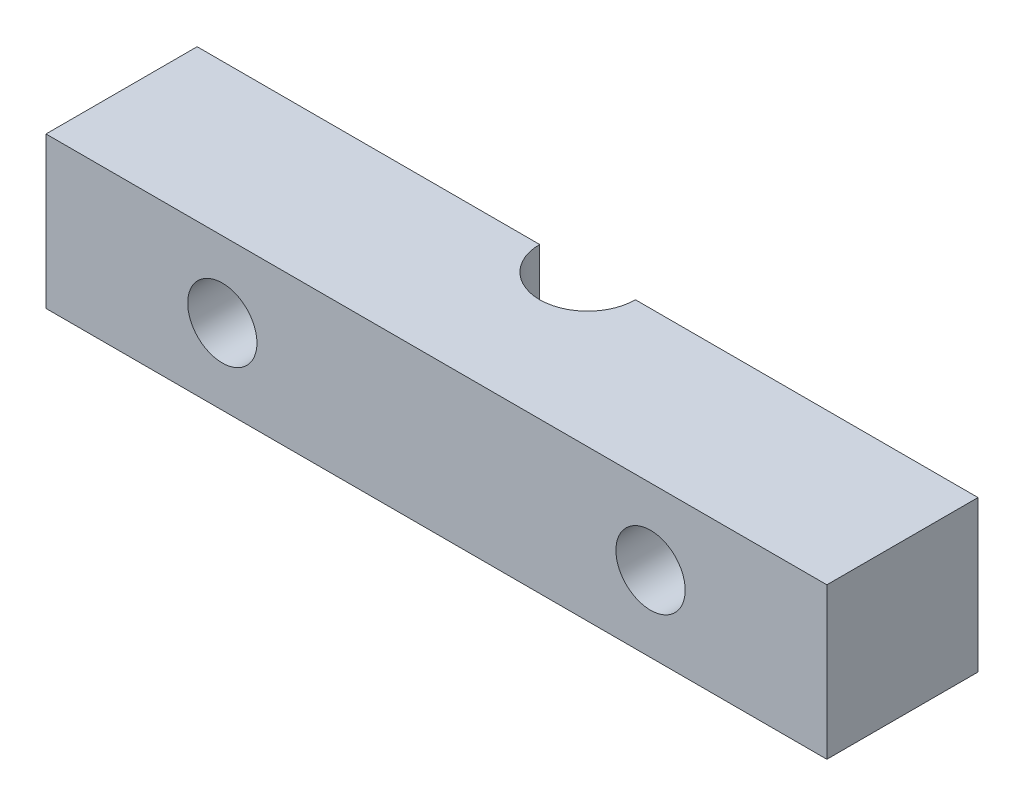
ISO-10303-21;
HEADER;
FILE_DESCRIPTION(('STEP AP214'),'2;1');
FILE_NAME('part.step','',(''),(''),'','','');
FILE_SCHEMA(('AUTOMOTIVE_DESIGN { 1 0 10303 214 1 1 1 1 }'));
ENDSEC;
DATA;
#1=APPLICATION_CONTEXT('core data for automotive mechanical design processes');
#2=APPLICATION_PROTOCOL_DEFINITION('international standard','automotive_design',2000,#1);
#3=PRODUCT_CONTEXT('',#1,'mechanical');
#4=PRODUCT('Part','Part','',(#3));
#5=PRODUCT_RELATED_PRODUCT_CATEGORY('part','',(#4));
#6=PRODUCT_DEFINITION_FORMATION('','',#4);
#7=PRODUCT_DEFINITION_CONTEXT('part definition',#1,'design');
#8=PRODUCT_DEFINITION('design','',#6,#7);
#9=PRODUCT_DEFINITION_SHAPE('','',#8);
#10=(LENGTH_UNIT() NAMED_UNIT(*) SI_UNIT(.MILLI.,.METRE.));
#11=(NAMED_UNIT(*) PLANE_ANGLE_UNIT() SI_UNIT($,.RADIAN.));
#12=(NAMED_UNIT(*) SI_UNIT($,.STERADIAN.) SOLID_ANGLE_UNIT());
#13=UNCERTAINTY_MEASURE_WITH_UNIT(LENGTH_MEASURE(1.E-05),#10,'distance_accuracy_value','');
#14=(GEOMETRIC_REPRESENTATION_CONTEXT(3) GLOBAL_UNCERTAINTY_ASSIGNED_CONTEXT((#13)) GLOBAL_UNIT_ASSIGNED_CONTEXT((#10,
#11,#12)) REPRESENTATION_CONTEXT('',''));
#15=CARTESIAN_POINT('',(0.,0.,0.));
#16=DIRECTION('',(0.,0.,1.));
#17=DIRECTION('',(1.,0.,0.));
#18=AXIS2_PLACEMENT_3D('',#15,#16,#17);
#19=CARTESIAN_POINT('',(0.,0.,0.));
#20=DIRECTION('',(0.,0.,1.));
#21=DIRECTION('',(1.,0.,0.));
#22=AXIS2_PLACEMENT_3D('',#19,#20,#21);
#23=PLANE('',#22);
#24=CARTESIAN_POINT('',(8.5,0.,0.));
#25=DIRECTION('',(0.,0.,1.));
#26=DIRECTION('',(1.,0.,0.));
#27=AXIS2_PLACEMENT_3D('',#24,#25,#26);
#28=CIRCLE('',#27,1.375);
#29=CARTESIAN_POINT('',(9.875,0.,0.));
#30=VERTEX_POINT('',#29);
#31=EDGE_CURVE('E119',#30,#30,#28,.T.);
#32=ORIENTED_EDGE('',*,*,#31,.T.);
#33=EDGE_LOOP('',(#32));
#34=FACE_BOUND('',#33,.T.);
#35=DIRECTION('',(1.,0.,0.));
#36=VECTOR('',#35,1.);
#37=CARTESIAN_POINT('',(-15.5,-3.,0.));
#38=LINE('',#37,#36);
#39=CARTESIAN_POINT('',(1.9,-3.,0.));
#40=VERTEX_POINT('',#39);
#41=CARTESIAN_POINT('',(15.5,-3.,0.));
#42=VERTEX_POINT('',#41);
#43=EDGE_CURVE('E87',#40,#42,#38,.T.);
#44=ORIENTED_EDGE('',*,*,#43,.F.);
#45=DIRECTION('',(0.,1.,0.));
#46=VECTOR('',#45,1.);
#47=CARTESIAN_POINT('',(1.9,-3.,0.));
#48=LINE('',#47,#46);
#49=CARTESIAN_POINT('',(1.9,3.,0.));
#50=VERTEX_POINT('',#49);
#51=EDGE_CURVE('E58',#40,#50,#48,.T.);
#52=ORIENTED_EDGE('',*,*,#51,.T.);
#53=DIRECTION('',(-1.,0.,0.));
#54=VECTOR('',#53,1.);
#55=CARTESIAN_POINT('',(-15.5,3.,0.));
#56=LINE('',#55,#54);
#57=CARTESIAN_POINT('',(15.5,3.,0.));
#58=VERTEX_POINT('',#57);
#59=EDGE_CURVE('E146',#58,#50,#56,.T.);
#60=ORIENTED_EDGE('',*,*,#59,.F.);
#61=DIRECTION('',(0.,1.,0.));
#62=VECTOR('',#61,1.);
#63=CARTESIAN_POINT('',(15.5,3.,0.));
#64=LINE('',#63,#62);
#65=EDGE_CURVE('E150',#42,#58,#64,.T.);
#66=ORIENTED_EDGE('',*,*,#65,.F.);
#67=EDGE_LOOP('',(#44,#52,#60,#66));
#68=FACE_BOUND('',#67,.T.);
#69=ADVANCED_FACE('F42',(#34,#68),#23,.F.);
#70=CARTESIAN_POINT('',(0.,0.,6.));
#71=DIRECTION('',(0.,0.,1.));
#72=DIRECTION('',(1.,0.,0.));
#73=AXIS2_PLACEMENT_3D('',#70,#71,#72);
#74=PLANE('',#73);
#75=CARTESIAN_POINT('',(-8.5,0.,6.));
#76=DIRECTION('',(0.,0.,1.));
#77=DIRECTION('',(1.,0.,0.));
#78=AXIS2_PLACEMENT_3D('',#75,#76,#77);
#79=CIRCLE('',#78,1.375);
#80=CARTESIAN_POINT('',(-7.125,0.,6.));
#81=VERTEX_POINT('',#80);
#82=EDGE_CURVE('E155',#81,#81,#79,.T.);
#83=ORIENTED_EDGE('',*,*,#82,.F.);
#84=EDGE_LOOP('',(#83));
#85=FACE_BOUND('',#84,.T.);
#86=DIRECTION('',(0.,1.,0.));
#87=VECTOR('',#86,1.);
#88=CARTESIAN_POINT('',(15.5,3.,6.));
#89=LINE('',#88,#87);
#90=CARTESIAN_POINT('',(15.5,-3.,6.));
#91=VERTEX_POINT('',#90);
#92=CARTESIAN_POINT('',(15.5,3.,6.));
#93=VERTEX_POINT('',#92);
#94=EDGE_CURVE('E126',#91,#93,#89,.T.);
#95=ORIENTED_EDGE('',*,*,#94,.T.);
#96=DIRECTION('',(-1.,0.,0.));
#97=VECTOR('',#96,1.);
#98=CARTESIAN_POINT('',(-15.5,3.,6.));
#99=LINE('',#98,#97);
#100=CARTESIAN_POINT('',(-15.5,3.,6.));
#101=VERTEX_POINT('',#100);
#102=EDGE_CURVE('E94',#93,#101,#99,.T.);
#103=ORIENTED_EDGE('',*,*,#102,.T.);
#104=DIRECTION('',(0.,-1.,0.));
#105=VECTOR('',#104,1.);
#106=CARTESIAN_POINT('',(-15.5,3.,6.));
#107=LINE('',#106,#105);
#108=CARTESIAN_POINT('',(-15.5,-3.,6.));
#109=VERTEX_POINT('',#108);
#110=EDGE_CURVE('E144',#101,#109,#107,.T.);
#111=ORIENTED_EDGE('',*,*,#110,.T.);
#112=DIRECTION('',(1.,0.,0.));
#113=VECTOR('',#112,1.);
#114=CARTESIAN_POINT('',(-15.5,-3.,6.));
#115=LINE('',#114,#113);
#116=EDGE_CURVE('E67',#109,#91,#115,.T.);
#117=ORIENTED_EDGE('',*,*,#116,.T.);
#118=EDGE_LOOP('',(#95,#103,#111,#117));
#119=FACE_BOUND('',#118,.T.);
#120=CARTESIAN_POINT('',(8.5,0.,6.));
#121=DIRECTION('',(0.,0.,1.));
#122=DIRECTION('',(1.,0.,0.));
#123=AXIS2_PLACEMENT_3D('',#120,#121,#122);
#124=CIRCLE('',#123,1.375);
#125=CARTESIAN_POINT('',(9.875,0.,6.));
#126=VERTEX_POINT('',#125);
#127=EDGE_CURVE('E166',#126,#126,#124,.T.);
#128=ORIENTED_EDGE('',*,*,#127,.F.);
#129=EDGE_LOOP('',(#128));
#130=FACE_BOUND('',#129,.T.);
#131=ADVANCED_FACE('F184',(#85,#119,#130),#74,.T.);
#132=CARTESIAN_POINT('',(-1.9,3.,0.));
#133=VERTEX_POINT('',#132);
#134=CARTESIAN_POINT('',(-15.5,3.,0.));
#135=VERTEX_POINT('',#134);
#136=EDGE_CURVE('E117',#133,#135,#56,.T.);
#137=ORIENTED_EDGE('',*,*,#136,.F.);
#138=DIRECTION('',(0.,1.,0.));
#139=VECTOR('',#138,1.);
#140=CARTESIAN_POINT('',(-1.9,-3.,0.));
#141=LINE('',#140,#139);
#142=CARTESIAN_POINT('',(-1.9,-3.,0.));
#143=VERTEX_POINT('',#142);
#144=EDGE_CURVE('E104',#143,#133,#141,.T.);
#145=ORIENTED_EDGE('',*,*,#144,.F.);
#146=CARTESIAN_POINT('',(-15.5,-3.,0.));
#147=VERTEX_POINT('',#146);
#148=EDGE_CURVE('E116',#147,#143,#38,.T.);
#149=ORIENTED_EDGE('',*,*,#148,.F.);
#150=DIRECTION('',(0.,-1.,0.));
#151=VECTOR('',#150,1.);
#152=CARTESIAN_POINT('',(-15.5,3.,0.));
#153=LINE('',#152,#151);
#154=EDGE_CURVE('E131',#135,#147,#153,.T.);
#155=ORIENTED_EDGE('',*,*,#154,.F.);
#156=EDGE_LOOP('',(#137,#145,#149,#155));
#157=FACE_BOUND('',#156,.T.);
#158=CARTESIAN_POINT('',(-8.5,0.,0.));
#159=DIRECTION('',(0.,0.,1.));
#160=DIRECTION('',(1.,0.,0.));
#161=AXIS2_PLACEMENT_3D('',#158,#159,#160);
#162=CIRCLE('',#161,1.375);
#163=CARTESIAN_POINT('',(-7.125,0.,0.));
#164=VERTEX_POINT('',#163);
#165=EDGE_CURVE('E162',#164,#164,#162,.T.);
#166=ORIENTED_EDGE('',*,*,#165,.T.);
#167=EDGE_LOOP('',(#166));
#168=FACE_BOUND('',#167,.T.);
#169=ADVANCED_FACE('F113',(#157,#168),#23,.F.);
#170=CARTESIAN_POINT('',(15.5,3.,6.));
#171=DIRECTION('',(-1.,0.,0.));
#172=DIRECTION('',(0.,0.,1.));
#173=AXIS2_PLACEMENT_3D('',#170,#171,#172);
#174=PLANE('',#173);
#175=ORIENTED_EDGE('',*,*,#65,.T.);
#176=DIRECTION('',(0.,0.,-1.));
#177=VECTOR('',#176,1.);
#178=CARTESIAN_POINT('',(15.5,3.,6.));
#179=LINE('',#178,#177);
#180=EDGE_CURVE('E11',#93,#58,#179,.T.);
#181=ORIENTED_EDGE('',*,*,#180,.F.);
#182=ORIENTED_EDGE('',*,*,#94,.F.);
#183=DIRECTION('',(0.,0.,-1.));
#184=VECTOR('',#183,1.);
#185=CARTESIAN_POINT('',(15.5,-3.,6.));
#186=LINE('',#185,#184);
#187=EDGE_CURVE('E135',#91,#42,#186,.T.);
#188=ORIENTED_EDGE('',*,*,#187,.T.);
#189=EDGE_LOOP('',(#175,#181,#182,#188));
#190=FACE_BOUND('',#189,.T.);
#191=ADVANCED_FACE('F44',(#190),#174,.F.);
#192=CARTESIAN_POINT('',(-15.5,3.,6.));
#193=DIRECTION('',(0.,-1.,0.));
#194=DIRECTION('',(0.,0.,-1.));
#195=AXIS2_PLACEMENT_3D('',#192,#193,#194);
#196=PLANE('',#195);
#197=ORIENTED_EDGE('',*,*,#59,.T.);
#198=CARTESIAN_POINT('',(0.,3.,0.));
#199=DIRECTION('',(0.,1.,0.));
#200=DIRECTION('',(0.,0.,1.));
#201=AXIS2_PLACEMENT_3D('',#198,#199,#200);
#202=CIRCLE('',#201,1.9);
#203=EDGE_CURVE('E108',#133,#50,#202,.T.);
#204=ORIENTED_EDGE('',*,*,#203,.F.);
#205=ORIENTED_EDGE('',*,*,#136,.T.);
#206=DIRECTION('',(0.,0.,-1.));
#207=VECTOR('',#206,1.);
#208=CARTESIAN_POINT('',(-15.5,3.,6.));
#209=LINE('',#208,#207);
#210=EDGE_CURVE('E51',#101,#135,#209,.T.);
#211=ORIENTED_EDGE('',*,*,#210,.F.);
#212=ORIENTED_EDGE('',*,*,#102,.F.);
#213=ORIENTED_EDGE('',*,*,#180,.T.);
#214=EDGE_LOOP('',(#197,#204,#205,#211,#212,#213));
#215=FACE_BOUND('',#214,.T.);
#216=ADVANCED_FACE('F209',(#215),#196,.F.);
#217=CARTESIAN_POINT('',(-15.5,3.,6.));
#218=DIRECTION('',(1.,0.,0.));
#219=DIRECTION('',(0.,0.,-1.));
#220=AXIS2_PLACEMENT_3D('',#217,#218,#219);
#221=PLANE('',#220);
#222=ORIENTED_EDGE('',*,*,#154,.T.);
#223=DIRECTION('',(0.,0.,-1.));
#224=VECTOR('',#223,1.);
#225=CARTESIAN_POINT('',(-15.5,-3.,6.));
#226=LINE('',#225,#224);
#227=EDGE_CURVE('E124',#109,#147,#226,.T.);
#228=ORIENTED_EDGE('',*,*,#227,.F.);
#229=ORIENTED_EDGE('',*,*,#110,.F.);
#230=ORIENTED_EDGE('',*,*,#210,.T.);
#231=EDGE_LOOP('',(#222,#228,#229,#230));
#232=FACE_BOUND('',#231,.T.);
#233=ADVANCED_FACE('F143',(#232),#221,.F.);
#234=CARTESIAN_POINT('',(-15.5,-3.,6.));
#235=DIRECTION('',(0.,1.,0.));
#236=DIRECTION('',(0.,0.,1.));
#237=AXIS2_PLACEMENT_3D('',#234,#235,#236);
#238=PLANE('',#237);
#239=ORIENTED_EDGE('',*,*,#148,.T.);
#240=CARTESIAN_POINT('',(0.,-3.,0.));
#241=DIRECTION('',(0.,1.,0.));
#242=DIRECTION('',(0.,0.,1.));
#243=AXIS2_PLACEMENT_3D('',#240,#241,#242);
#244=CIRCLE('',#243,1.9);
#245=EDGE_CURVE('E101',#143,#40,#244,.T.);
#246=ORIENTED_EDGE('',*,*,#245,.T.);
#247=ORIENTED_EDGE('',*,*,#43,.T.);
#248=ORIENTED_EDGE('',*,*,#187,.F.);
#249=ORIENTED_EDGE('',*,*,#116,.F.);
#250=ORIENTED_EDGE('',*,*,#227,.T.);
#251=EDGE_LOOP('',(#239,#246,#247,#248,#249,#250));
#252=FACE_BOUND('',#251,.T.);
#253=ADVANCED_FACE('F122',(#252),#238,.F.);
#254=CARTESIAN_POINT('',(-8.5,0.,6.));
#255=DIRECTION('',(0.,0.,-1.));
#256=DIRECTION('',(-1.,0.,0.));
#257=AXIS2_PLACEMENT_3D('',#254,#255,#256);
#258=CYLINDRICAL_SURFACE('',#257,1.375);
#259=ORIENTED_EDGE('',*,*,#82,.T.);
#260=EDGE_LOOP('',(#259));
#261=FACE_BOUND('',#260,.T.);
#262=ORIENTED_EDGE('',*,*,#165,.F.);
#263=EDGE_LOOP('',(#262));
#264=FACE_BOUND('',#263,.T.);
#265=ADVANCED_FACE('F194',(#261,#264),#258,.F.);
#266=CARTESIAN_POINT('',(8.5,0.,6.));
#267=DIRECTION('',(0.,0.,-1.));
#268=DIRECTION('',(-1.,0.,0.));
#269=AXIS2_PLACEMENT_3D('',#266,#267,#268);
#270=CYLINDRICAL_SURFACE('',#269,1.375);
#271=ORIENTED_EDGE('',*,*,#127,.T.);
#272=EDGE_LOOP('',(#271));
#273=FACE_BOUND('',#272,.T.);
#274=ORIENTED_EDGE('',*,*,#31,.F.);
#275=EDGE_LOOP('',(#274));
#276=FACE_BOUND('',#275,.T.);
#277=ADVANCED_FACE('F191',(#273,#276),#270,.F.);
#278=CARTESIAN_POINT('',(0.,-3.,0.));
#279=DIRECTION('',(0.,1.,0.));
#280=DIRECTION('',(0.,0.,1.));
#281=AXIS2_PLACEMENT_3D('',#278,#279,#280);
#282=CYLINDRICAL_SURFACE('',#281,1.9);
#283=ORIENTED_EDGE('',*,*,#203,.T.);
#284=ORIENTED_EDGE('',*,*,#51,.F.);
#285=ORIENTED_EDGE('',*,*,#245,.F.);
#286=ORIENTED_EDGE('',*,*,#144,.T.);
#287=EDGE_LOOP('',(#283,#284,#285,#286));
#288=FACE_BOUND('',#287,.T.);
#289=ADVANCED_FACE('F103',(#288),#282,.F.);
#290=CLOSED_SHELL('',(#69,#131,#169,#191,#216,#233,#253,#265,#277,#289));
#291=MANIFOLD_SOLID_BREP('B2',#290);
#292=ADVANCED_BREP_SHAPE_REPRESENTATION('',(#18,#291),#14);
#293=SHAPE_DEFINITION_REPRESENTATION(#9,#292);
ENDSEC;
END-ISO-10303-21;
